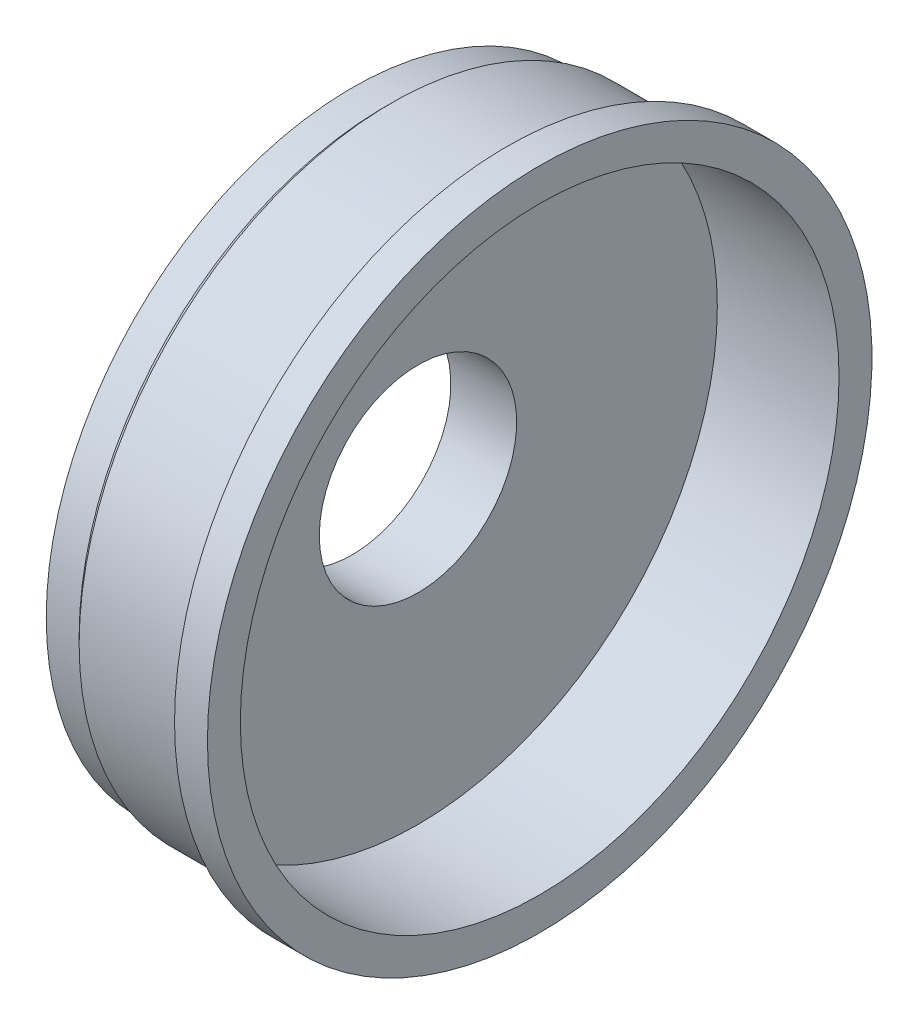
ISO-10303-21;
HEADER;
FILE_DESCRIPTION(('STEP AP214'),'2;1');
FILE_NAME('part.step','',(''),(''),'','','');
FILE_SCHEMA(('AUTOMOTIVE_DESIGN { 1 0 10303 214 1 1 1 1 }'));
ENDSEC;
DATA;
#1=APPLICATION_CONTEXT('core data for automotive mechanical design processes');
#2=APPLICATION_PROTOCOL_DEFINITION('international standard','automotive_design',2000,#1);
#3=PRODUCT_CONTEXT('',#1,'mechanical');
#4=PRODUCT('Part','Part','',(#3));
#5=PRODUCT_RELATED_PRODUCT_CATEGORY('part','',(#4));
#6=PRODUCT_DEFINITION_FORMATION('','',#4);
#7=PRODUCT_DEFINITION_CONTEXT('part definition',#1,'design');
#8=PRODUCT_DEFINITION('design','',#6,#7);
#9=PRODUCT_DEFINITION_SHAPE('','',#8);
#10=(LENGTH_UNIT() NAMED_UNIT(*) SI_UNIT(.MILLI.,.METRE.));
#11=(NAMED_UNIT(*) PLANE_ANGLE_UNIT() SI_UNIT($,.RADIAN.));
#12=(NAMED_UNIT(*) SI_UNIT($,.STERADIAN.) SOLID_ANGLE_UNIT());
#13=UNCERTAINTY_MEASURE_WITH_UNIT(LENGTH_MEASURE(1.E-05),#10,'distance_accuracy_value','');
#14=(GEOMETRIC_REPRESENTATION_CONTEXT(3) GLOBAL_UNCERTAINTY_ASSIGNED_CONTEXT((#13)) GLOBAL_UNIT_ASSIGNED_CONTEXT((#10,
#11,#12)) REPRESENTATION_CONTEXT('',''));
#15=CARTESIAN_POINT('',(0.,0.,0.));
#16=DIRECTION('',(0.,0.,1.));
#17=DIRECTION('',(1.,0.,0.));
#18=AXIS2_PLACEMENT_3D('',#15,#16,#17);
#19=CARTESIAN_POINT('',(-14.9225,29.5275,0.));
#20=DIRECTION('',(1.,0.,0.));
#21=DIRECTION('',(0.,0.,-1.));
#22=AXIS2_PLACEMENT_3D('',#19,#20,#21);
#23=PLANE('',#22);
#24=CARTESIAN_POINT('',(-14.9225,0.,0.));
#25=DIRECTION('',(-1.,0.,0.));
#26=DIRECTION('',(0.,0.,1.));
#27=AXIS2_PLACEMENT_3D('',#24,#25,#26);
#28=CIRCLE('',#27,9.525);
#29=CARTESIAN_POINT('',(-14.9225,0.,9.525));
#30=VERTEX_POINT('',#29);
#31=EDGE_CURVE('E10',#30,#30,#28,.T.);
#32=ORIENTED_EDGE('',*,*,#31,.F.);
#33=EDGE_LOOP('',(#32));
#34=FACE_BOUND('',#33,.T.);
#35=CARTESIAN_POINT('',(-14.9225,0.,0.));
#36=DIRECTION('',(-1.,0.,0.));
#37=DIRECTION('',(0.,0.,1.));
#38=AXIS2_PLACEMENT_3D('',#35,#36,#37);
#39=CIRCLE('',#38,29.5275);
#40=CARTESIAN_POINT('',(-14.9225,0.,29.5275));
#41=VERTEX_POINT('',#40);
#42=EDGE_CURVE('E69',#41,#41,#39,.T.);
#43=ORIENTED_EDGE('',*,*,#42,.T.);
#44=EDGE_LOOP('',(#43));
#45=FACE_BOUND('',#44,.T.);
#46=ADVANCED_FACE('F35',(#34,#45),#23,.F.);
#47=CARTESIAN_POINT('',(0.,0.,0.));
#48=DIRECTION('',(-1.,0.,0.));
#49=DIRECTION('',(0.,0.,1.));
#50=AXIS2_PLACEMENT_3D('',#47,#48,#49);
#51=CYLINDRICAL_SURFACE('',#50,9.525);
#52=CARTESIAN_POINT('',(-8.5725,0.,0.));
#53=DIRECTION('',(-1.,0.,0.));
#54=DIRECTION('',(0.,0.,1.));
#55=AXIS2_PLACEMENT_3D('',#52,#53,#54);
#56=CIRCLE('',#55,9.525);
#57=CARTESIAN_POINT('',(-8.5725,0.,9.525));
#58=VERTEX_POINT('',#57);
#59=EDGE_CURVE('E41',#58,#58,#56,.T.);
#60=ORIENTED_EDGE('',*,*,#59,.F.);
#61=EDGE_LOOP('',(#60));
#62=FACE_BOUND('',#61,.T.);
#63=ORIENTED_EDGE('',*,*,#31,.T.);
#64=EDGE_LOOP('',(#63));
#65=FACE_BOUND('',#64,.T.);
#66=ADVANCED_FACE('F118',(#62,#65),#51,.F.);
#67=CARTESIAN_POINT('',(-8.5725,9.525,0.));
#68=DIRECTION('',(-1.,0.,0.));
#69=DIRECTION('',(0.,0.,1.));
#70=AXIS2_PLACEMENT_3D('',#67,#68,#69);
#71=PLANE('',#70);
#72=CARTESIAN_POINT('',(-8.5725,0.,0.));
#73=DIRECTION('',(-1.,0.,0.));
#74=DIRECTION('',(0.,0.,1.));
#75=AXIS2_PLACEMENT_3D('',#72,#73,#74);
#76=CIRCLE('',#75,28.8925);
#77=CARTESIAN_POINT('',(-8.5725,0.,28.8925));
#78=VERTEX_POINT('',#77);
#79=EDGE_CURVE('E45',#78,#78,#76,.T.);
#80=ORIENTED_EDGE('',*,*,#79,.F.);
#81=EDGE_LOOP('',(#80));
#82=FACE_BOUND('',#81,.T.);
#83=ORIENTED_EDGE('',*,*,#59,.T.);
#84=EDGE_LOOP('',(#83));
#85=FACE_BOUND('',#84,.T.);
#86=ADVANCED_FACE('F113',(#82,#85),#71,.F.);
#87=CARTESIAN_POINT('',(0.,0.,0.));
#88=DIRECTION('',(-1.,0.,0.));
#89=DIRECTION('',(0.,0.,1.));
#90=AXIS2_PLACEMENT_3D('',#87,#88,#89);
#91=CYLINDRICAL_SURFACE('',#90,28.8925);
#92=CARTESIAN_POINT('',(3.175,0.,0.));
#93=DIRECTION('',(-1.,0.,0.));
#94=DIRECTION('',(0.,0.,1.));
#95=AXIS2_PLACEMENT_3D('',#92,#93,#94);
#96=CIRCLE('',#95,28.8925);
#97=CARTESIAN_POINT('',(3.175,0.,28.8925));
#98=VERTEX_POINT('',#97);
#99=EDGE_CURVE('E49',#98,#98,#96,.T.);
#100=ORIENTED_EDGE('',*,*,#99,.F.);
#101=EDGE_LOOP('',(#100));
#102=FACE_BOUND('',#101,.T.);
#103=ORIENTED_EDGE('',*,*,#79,.T.);
#104=EDGE_LOOP('',(#103));
#105=FACE_BOUND('',#104,.T.);
#106=ADVANCED_FACE('F107',(#102,#105),#91,.F.);
#107=CARTESIAN_POINT('',(3.175,28.8925,0.));
#108=DIRECTION('',(-1.,0.,0.));
#109=DIRECTION('',(0.,0.,1.));
#110=AXIS2_PLACEMENT_3D('',#107,#108,#109);
#111=PLANE('',#110);
#112=CARTESIAN_POINT('',(3.175,0.,0.));
#113=DIRECTION('',(-1.,0.,0.));
#114=DIRECTION('',(0.,0.,1.));
#115=AXIS2_PLACEMENT_3D('',#112,#113,#114);
#116=CIRCLE('',#115,32.0675);
#117=CARTESIAN_POINT('',(3.175,0.,32.0675));
#118=VERTEX_POINT('',#117);
#119=EDGE_CURVE('E54',#118,#118,#116,.T.);
#120=ORIENTED_EDGE('',*,*,#119,.F.);
#121=EDGE_LOOP('',(#120));
#122=FACE_BOUND('',#121,.T.);
#123=ORIENTED_EDGE('',*,*,#99,.T.);
#124=EDGE_LOOP('',(#123));
#125=FACE_BOUND('',#124,.T.);
#126=ADVANCED_FACE('F101',(#122,#125),#111,.F.);
#127=CARTESIAN_POINT('',(0.,0.,0.));
#128=DIRECTION('',(-1.,0.,0.));
#129=DIRECTION('',(0.,0.,1.));
#130=AXIS2_PLACEMENT_3D('',#127,#128,#129);
#131=CYLINDRICAL_SURFACE('',#130,32.0675);
#132=CARTESIAN_POINT('',(0.,0.,0.));
#133=DIRECTION('',(-1.,0.,0.));
#134=DIRECTION('',(0.,0.,1.));
#135=AXIS2_PLACEMENT_3D('',#132,#133,#134);
#136=CIRCLE('',#135,32.0675);
#137=CARTESIAN_POINT('',(0.,0.,32.0675));
#138=VERTEX_POINT('',#137);
#139=EDGE_CURVE('E57',#138,#138,#136,.T.);
#140=ORIENTED_EDGE('',*,*,#139,.F.);
#141=EDGE_LOOP('',(#140));
#142=FACE_BOUND('',#141,.T.);
#143=ORIENTED_EDGE('',*,*,#119,.T.);
#144=EDGE_LOOP('',(#143));
#145=FACE_BOUND('',#144,.T.);
#146=ADVANCED_FACE('F95',(#142,#145),#131,.T.);
#147=CARTESIAN_POINT('',(0.,32.0675,0.));
#148=DIRECTION('',(1.,0.,0.));
#149=DIRECTION('',(0.,0.,-1.));
#150=AXIS2_PLACEMENT_3D('',#147,#148,#149);
#151=PLANE('',#150);
#152=CARTESIAN_POINT('',(0.,0.,0.));
#153=DIRECTION('',(-1.,0.,0.));
#154=DIRECTION('',(0.,0.,1.));
#155=AXIS2_PLACEMENT_3D('',#152,#153,#154);
#156=CIRCLE('',#155,30.1625);
#157=CARTESIAN_POINT('',(0.,0.,30.1625));
#158=VERTEX_POINT('',#157);
#159=EDGE_CURVE('E60',#158,#158,#156,.T.);
#160=ORIENTED_EDGE('',*,*,#159,.F.);
#161=EDGE_LOOP('',(#160));
#162=FACE_BOUND('',#161,.T.);
#163=ORIENTED_EDGE('',*,*,#139,.T.);
#164=EDGE_LOOP('',(#163));
#165=FACE_BOUND('',#164,.T.);
#166=ADVANCED_FACE('F89',(#162,#165),#151,.F.);
#167=CARTESIAN_POINT('',(0.,0.,0.));
#168=DIRECTION('',(-1.,0.,0.));
#169=DIRECTION('',(0.,0.,1.));
#170=AXIS2_PLACEMENT_3D('',#167,#168,#169);
#171=CYLINDRICAL_SURFACE('',#170,30.1625);
#172=CARTESIAN_POINT('',(-11.1125,0.,0.));
#173=DIRECTION('',(-1.,0.,0.));
#174=DIRECTION('',(0.,0.,1.));
#175=AXIS2_PLACEMENT_3D('',#172,#173,#174);
#176=CIRCLE('',#175,30.1625);
#177=CARTESIAN_POINT('',(-11.1125,0.,30.1625));
#178=VERTEX_POINT('',#177);
#179=EDGE_CURVE('E63',#178,#178,#176,.T.);
#180=ORIENTED_EDGE('',*,*,#179,.F.);
#181=EDGE_LOOP('',(#180));
#182=FACE_BOUND('',#181,.T.);
#183=ORIENTED_EDGE('',*,*,#159,.T.);
#184=EDGE_LOOP('',(#183));
#185=FACE_BOUND('',#184,.T.);
#186=ADVANCED_FACE('F83',(#182,#185),#171,.T.);
#187=CARTESIAN_POINT('',(-11.1125,0.,0.));
#188=DIRECTION('',(1.,0.,0.));
#189=DIRECTION('',(0.,0.,-1.));
#190=AXIS2_PLACEMENT_3D('',#187,#188,#189);
#191=CONICAL_SURFACE('',#190,30.1625,0.78539816339744);
#192=CARTESIAN_POINT('',(-11.7475,0.,0.));
#193=DIRECTION('',(-1.,0.,0.));
#194=DIRECTION('',(0.,0.,1.));
#195=AXIS2_PLACEMENT_3D('',#192,#193,#194);
#196=CIRCLE('',#195,29.5275);
#197=CARTESIAN_POINT('',(-11.7475,0.,29.5275));
#198=VERTEX_POINT('',#197);
#199=EDGE_CURVE('E66',#198,#198,#196,.T.);
#200=ORIENTED_EDGE('',*,*,#199,.F.);
#201=EDGE_LOOP('',(#200));
#202=FACE_BOUND('',#201,.T.);
#203=ORIENTED_EDGE('',*,*,#179,.T.);
#204=EDGE_LOOP('',(#203));
#205=FACE_BOUND('',#204,.T.);
#206=ADVANCED_FACE('F77',(#202,#205),#191,.T.);
#207=CARTESIAN_POINT('',(0.,0.,0.));
#208=DIRECTION('',(-1.,0.,0.));
#209=DIRECTION('',(0.,0.,1.));
#210=AXIS2_PLACEMENT_3D('',#207,#208,#209);
#211=CYLINDRICAL_SURFACE('',#210,29.5275);
#212=ORIENTED_EDGE('',*,*,#42,.F.);
#213=EDGE_LOOP('',(#212));
#214=FACE_BOUND('',#213,.T.);
#215=ORIENTED_EDGE('',*,*,#199,.T.);
#216=EDGE_LOOP('',(#215));
#217=FACE_BOUND('',#216,.T.);
#218=ADVANCED_FACE('F74',(#214,#217),#211,.T.);
#219=CLOSED_SHELL('',(#46,#66,#86,#106,#126,#146,#166,#186,#206,#218));
#220=MANIFOLD_SOLID_BREP('B2',#219);
#221=ADVANCED_BREP_SHAPE_REPRESENTATION('',(#18,#220),#14);
#222=SHAPE_DEFINITION_REPRESENTATION(#9,#221);
ENDSEC;
END-ISO-10303-21;
